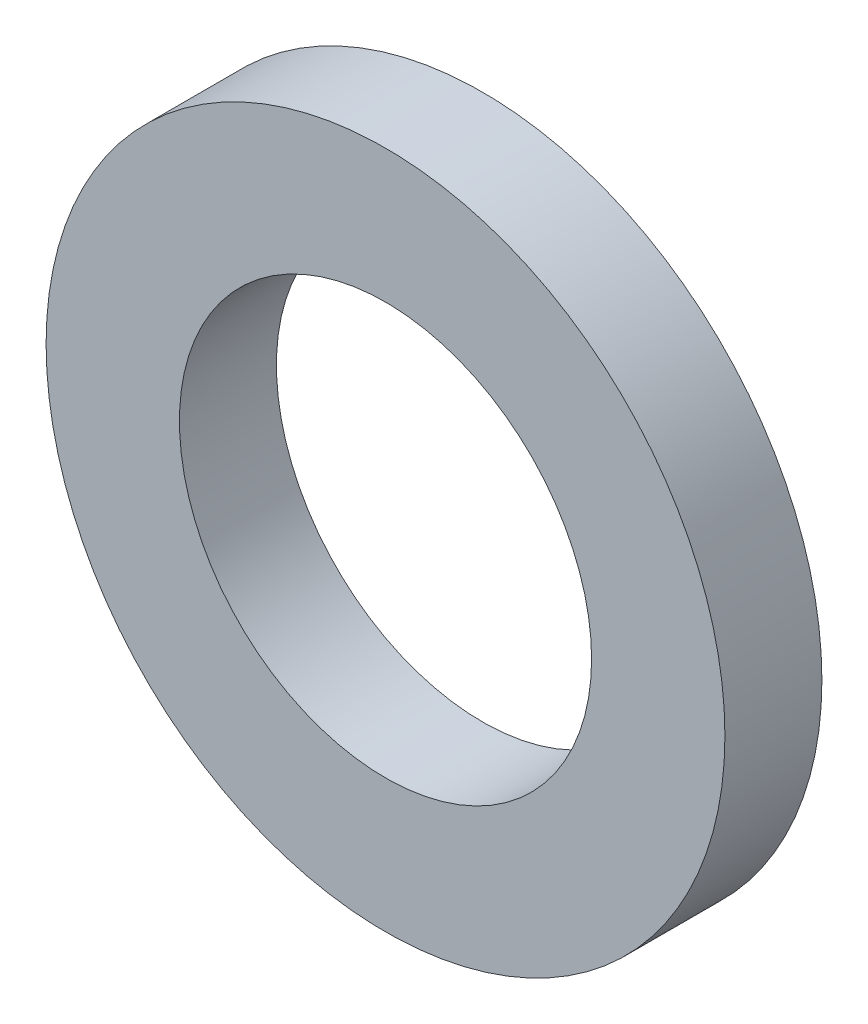
ISO-10303-21;
HEADER;
FILE_DESCRIPTION(('STEP AP214'),'2;1');
FILE_NAME('part.step','',(''),(''),'','','');
FILE_SCHEMA(('AUTOMOTIVE_DESIGN { 1 0 10303 214 1 1 1 1 }'));
ENDSEC;
DATA;
#1=APPLICATION_CONTEXT('core data for automotive mechanical design processes');
#2=APPLICATION_PROTOCOL_DEFINITION('international standard','automotive_design',2000,#1);
#3=PRODUCT_CONTEXT('',#1,'mechanical');
#4=PRODUCT('Part','Part','',(#3));
#5=PRODUCT_RELATED_PRODUCT_CATEGORY('part','',(#4));
#6=PRODUCT_DEFINITION_FORMATION('','',#4);
#7=PRODUCT_DEFINITION_CONTEXT('part definition',#1,'design');
#8=PRODUCT_DEFINITION('design','',#6,#7);
#9=PRODUCT_DEFINITION_SHAPE('','',#8);
#10=(LENGTH_UNIT() NAMED_UNIT(*) SI_UNIT(.MILLI.,.METRE.));
#11=(NAMED_UNIT(*) PLANE_ANGLE_UNIT() SI_UNIT($,.RADIAN.));
#12=(NAMED_UNIT(*) SI_UNIT($,.STERADIAN.) SOLID_ANGLE_UNIT());
#13=UNCERTAINTY_MEASURE_WITH_UNIT(LENGTH_MEASURE(1.E-05),#10,'distance_accuracy_value','');
#14=(GEOMETRIC_REPRESENTATION_CONTEXT(3) GLOBAL_UNCERTAINTY_ASSIGNED_CONTEXT((#13)) GLOBAL_UNIT_ASSIGNED_CONTEXT((#10,
#11,#12)) REPRESENTATION_CONTEXT('',''));
#15=CARTESIAN_POINT('',(0.,0.,0.));
#16=DIRECTION('',(0.,0.,1.));
#17=DIRECTION('',(1.,0.,0.));
#18=AXIS2_PLACEMENT_3D('',#15,#16,#17);
#19=CARTESIAN_POINT('',(0.,0.,0.));
#20=DIRECTION('',(0.,0.,-1.));
#21=DIRECTION('',(1.,0.,0.));
#22=AXIS2_PLACEMENT_3D('',#19,#20,#21);
#23=CYLINDRICAL_SURFACE('',#22,0.6999986);
#24=CARTESIAN_POINT('',(0.,0.,0.1999996));
#25=DIRECTION('',(0.,0.,1.));
#26=DIRECTION('',(1.,0.,0.));
#27=AXIS2_PLACEMENT_3D('',#24,#25,#26);
#28=CIRCLE('',#27,0.6999986);
#29=CARTESIAN_POINT('',(0.6999986,0.,0.1999996));
#30=VERTEX_POINT('',#29);
#31=EDGE_CURVE('E11',#30,#30,#28,.T.);
#32=ORIENTED_EDGE('',*,*,#31,.F.);
#33=DIRECTION('',(0.,0.,1.));
#34=VECTOR('',#33,1.);
#35=CARTESIAN_POINT('',(0.6999986,0.,0.));
#36=LINE('',#35,#34);
#37=CARTESIAN_POINT('',(0.6999986,0.,0.));
#38=VERTEX_POINT('',#37);
#39=EDGE_CURVE('E24',#38,#30,#36,.T.);
#40=ORIENTED_EDGE('',*,*,#39,.F.);
#41=CARTESIAN_POINT('',(0.,0.,0.));
#42=DIRECTION('',(0.,0.,1.));
#43=DIRECTION('',(1.,0.,0.));
#44=AXIS2_PLACEMENT_3D('',#41,#42,#43);
#45=CIRCLE('',#44,0.6999986);
#46=EDGE_CURVE('E46',#38,#38,#45,.T.);
#47=ORIENTED_EDGE('',*,*,#46,.T.);
#48=ORIENTED_EDGE('',*,*,#39,.T.);
#49=EDGE_LOOP('',(#32,#40,#47,#48));
#50=FACE_BOUND('',#49,.T.);
#51=ADVANCED_FACE('F17',(#50),#23,.T.);
#52=CARTESIAN_POINT('',(0.,0.,0.));
#53=DIRECTION('',(0.,0.,-1.));
#54=DIRECTION('',(1.,0.,0.));
#55=AXIS2_PLACEMENT_3D('',#52,#53,#54);
#56=CYLINDRICAL_SURFACE('',#55,0.42500042);
#57=DIRECTION('',(0.,0.,1.));
#58=VECTOR('',#57,1.);
#59=CARTESIAN_POINT('',(0.42500042,0.,0.));
#60=LINE('',#59,#58);
#61=CARTESIAN_POINT('',(0.42500042,0.,0.));
#62=VERTEX_POINT('',#61);
#63=CARTESIAN_POINT('',(0.42500042,0.,0.1999996));
#64=VERTEX_POINT('',#63);
#65=EDGE_CURVE('E40',#62,#64,#60,.T.);
#66=ORIENTED_EDGE('',*,*,#65,.T.);
#67=CARTESIAN_POINT('',(0.,0.,0.1999996));
#68=DIRECTION('',(0.,0.,1.));
#69=DIRECTION('',(1.,0.,0.));
#70=AXIS2_PLACEMENT_3D('',#67,#68,#69);
#71=CIRCLE('',#70,0.42500042);
#72=EDGE_CURVE('E45',#64,#64,#71,.T.);
#73=ORIENTED_EDGE('',*,*,#72,.T.);
#74=ORIENTED_EDGE('',*,*,#65,.F.);
#75=CARTESIAN_POINT('',(0.,0.,0.));
#76=DIRECTION('',(0.,0.,1.));
#77=DIRECTION('',(1.,0.,0.));
#78=AXIS2_PLACEMENT_3D('',#75,#76,#77);
#79=CIRCLE('',#78,0.42500042);
#80=EDGE_CURVE('E43',#62,#62,#79,.T.);
#81=ORIENTED_EDGE('',*,*,#80,.F.);
#82=EDGE_LOOP('',(#66,#73,#74,#81));
#83=FACE_BOUND('',#82,.T.);
#84=ADVANCED_FACE('F42',(#83),#56,.F.);
#85=CARTESIAN_POINT('',(0.6999986,0.,0.));
#86=DIRECTION('',(0.,0.,-1.));
#87=DIRECTION('',(-1.,0.,0.));
#88=AXIS2_PLACEMENT_3D('',#85,#86,#87);
#89=PLANE('',#88);
#90=ORIENTED_EDGE('',*,*,#46,.F.);
#91=EDGE_LOOP('',(#90));
#92=FACE_BOUND('',#91,.T.);
#93=ORIENTED_EDGE('',*,*,#80,.T.);
#94=EDGE_LOOP('',(#93));
#95=FACE_BOUND('',#94,.T.);
#96=ADVANCED_FACE('F49',(#92,#95),#89,.T.);
#97=CARTESIAN_POINT('',(0.6999986,0.,0.1999996));
#98=DIRECTION('',(0.,0.,-1.));
#99=DIRECTION('',(-1.,0.,0.));
#100=AXIS2_PLACEMENT_3D('',#97,#98,#99);
#101=PLANE('',#100);
#102=ORIENTED_EDGE('',*,*,#31,.T.);
#103=EDGE_LOOP('',(#102));
#104=FACE_BOUND('',#103,.T.);
#105=ORIENTED_EDGE('',*,*,#72,.F.);
#106=EDGE_LOOP('',(#105));
#107=FACE_BOUND('',#106,.T.);
#108=ADVANCED_FACE('F56',(#104,#107),#101,.F.);
#109=CLOSED_SHELL('',(#51,#84,#96,#108));
#110=MANIFOLD_SOLID_BREP('B1',#109);
#111=ADVANCED_BREP_SHAPE_REPRESENTATION('',(#18,#110),#14);
#112=SHAPE_DEFINITION_REPRESENTATION(#9,#111);
ENDSEC;
END-ISO-10303-21;
